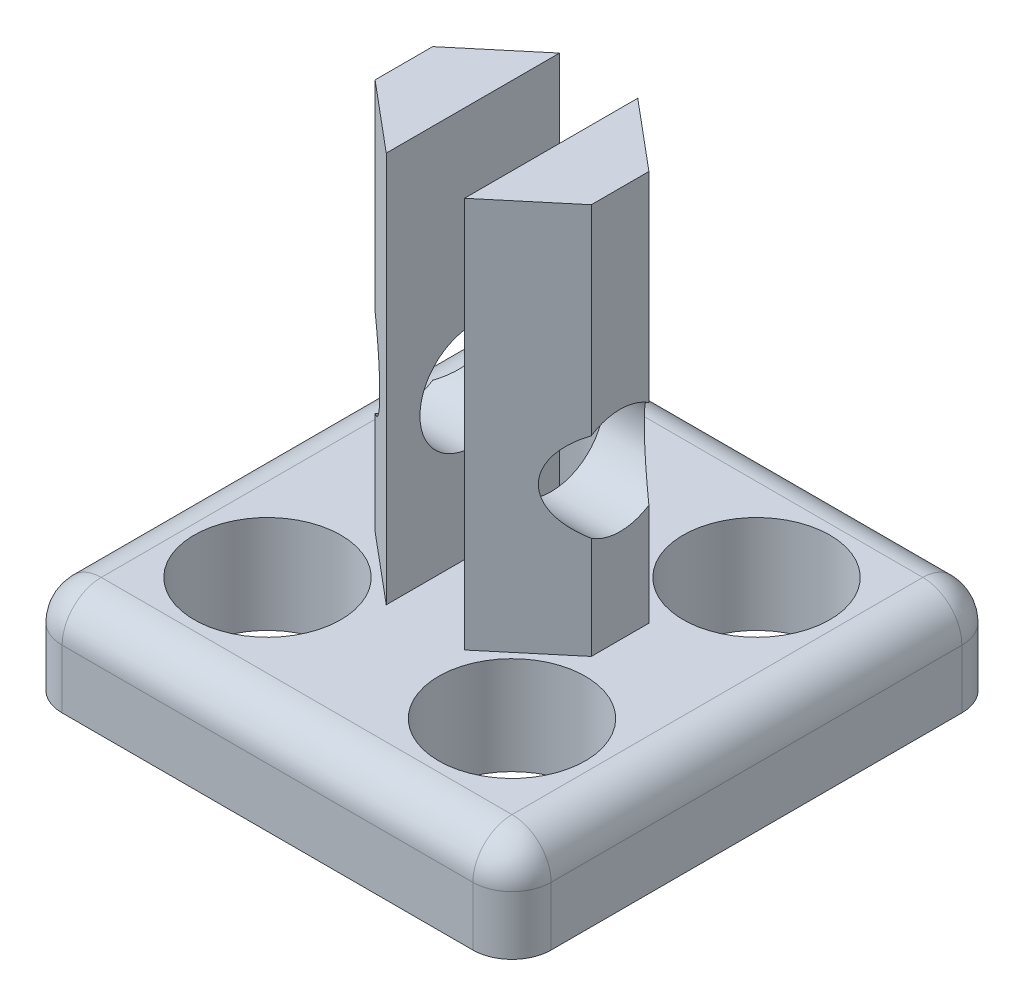
ISO-10303-21;
HEADER;
FILE_DESCRIPTION(('STEP AP214'),'2;1');
FILE_NAME('part.step','',(''),(''),'','','');
FILE_SCHEMA(('AUTOMOTIVE_DESIGN { 1 0 10303 214 1 1 1 1 }'));
ENDSEC;
DATA;
#1=APPLICATION_CONTEXT('core data for automotive mechanical design processes');
#2=APPLICATION_PROTOCOL_DEFINITION('international standard','automotive_design',2000,#1);
#3=PRODUCT_CONTEXT('',#1,'mechanical');
#4=PRODUCT('Part','Part','',(#3));
#5=PRODUCT_RELATED_PRODUCT_CATEGORY('part','',(#4));
#6=PRODUCT_DEFINITION_FORMATION('','',#4);
#7=PRODUCT_DEFINITION_CONTEXT('part definition',#1,'design');
#8=PRODUCT_DEFINITION('design','',#6,#7);
#9=PRODUCT_DEFINITION_SHAPE('','',#8);
#10=(LENGTH_UNIT() NAMED_UNIT(*) SI_UNIT(.MILLI.,.METRE.));
#11=(NAMED_UNIT(*) PLANE_ANGLE_UNIT() SI_UNIT($,.RADIAN.));
#12=(NAMED_UNIT(*) SI_UNIT($,.STERADIAN.) SOLID_ANGLE_UNIT());
#13=UNCERTAINTY_MEASURE_WITH_UNIT(LENGTH_MEASURE(1.E-05),#10,'distance_accuracy_value','');
#14=(GEOMETRIC_REPRESENTATION_CONTEXT(3) GLOBAL_UNCERTAINTY_ASSIGNED_CONTEXT((#13)) GLOBAL_UNIT_ASSIGNED_CONTEXT((#10,
#11,#12)) REPRESENTATION_CONTEXT('',''));
#15=CARTESIAN_POINT('',(0.,0.,0.));
#16=DIRECTION('',(0.,0.,1.));
#17=DIRECTION('',(1.,0.,0.));
#18=AXIS2_PLACEMENT_3D('',#15,#16,#17);
#19=CARTESIAN_POINT('',(-2.80786493422615,12.7,0.));
#20=DIRECTION('',(1.,0.,0.));
#21=DIRECTION('',(0.,0.,-1.));
#22=AXIS2_PLACEMENT_3D('',#19,#20,#21);
#23=PLANE('',#22);
#24=DIRECTION('',(0.,-1.,0.));
#25=VECTOR('',#24,1.);
#26=CARTESIAN_POINT('',(-2.80786493422615,12.7,-0.747994784831007));
#27=LINE('',#26,#25);
#28=CARTESIAN_POINT('',(-2.80786493422615,12.7,-0.747994784831007));
#29=VERTEX_POINT('',#28);
#30=CARTESIAN_POINT('',(-2.80786493422615,7.50374555334598,-0.747994784831007));
#31=VERTEX_POINT('',#30);
#32=EDGE_CURVE('E280',#29,#31,#27,.T.);
#33=ORIENTED_EDGE('',*,*,#32,.T.);
#34=CARTESIAN_POINT('',(-2.80786493422615,6.35,0.));
#35=DIRECTION('',(1.,0.,0.));
#36=DIRECTION('',(0.,0.,-1.));
#37=AXIS2_PLACEMENT_3D('',#34,#35,#36);
#38=CIRCLE('',#37,1.375);
#39=CARTESIAN_POINT('',(-2.80786493422615,7.50374555334598,0.747994784831009));
#40=VERTEX_POINT('',#39);
#41=EDGE_CURVE('E455',#31,#40,#38,.T.);
#42=ORIENTED_EDGE('',*,*,#41,.T.);
#43=DIRECTION('',(0.,-1.,0.));
#44=VECTOR('',#43,1.);
#45=CARTESIAN_POINT('',(-2.80786493422615,12.7,0.747994784831009));
#46=LINE('',#45,#44);
#47=CARTESIAN_POINT('',(-2.80786493422615,12.7,0.747994784831009));
#48=VERTEX_POINT('',#47);
#49=EDGE_CURVE('E275',#48,#40,#46,.T.);
#50=ORIENTED_EDGE('',*,*,#49,.F.);
#51=DIRECTION('',(0.,0.,1.));
#52=VECTOR('',#51,1.);
#53=CARTESIAN_POINT('',(-2.80786493422615,12.7,0.));
#54=LINE('',#53,#52);
#55=EDGE_CURVE('E243',#29,#48,#54,.T.);
#56=ORIENTED_EDGE('',*,*,#55,.F.);
#57=EDGE_LOOP('',(#33,#42,#50,#56));
#58=FACE_BOUND('',#57,.T.);
#59=ADVANCED_FACE('F46',(#58),#23,.F.);
#60=CARTESIAN_POINT('',(2.80786493422615,12.7,0.));
#61=DIRECTION('',(-1.,0.,0.));
#62=DIRECTION('',(0.,0.,1.));
#63=AXIS2_PLACEMENT_3D('',#60,#61,#62);
#64=PLANE('',#63);
#65=DIRECTION('',(0.,-1.,0.));
#66=VECTOR('',#65,1.);
#67=CARTESIAN_POINT('',(2.80786493422615,12.7,0.747994784831009));
#68=LINE('',#67,#66);
#69=CARTESIAN_POINT('',(2.80786493422615,12.7,0.747994784831009));
#70=VERTEX_POINT('',#69);
#71=CARTESIAN_POINT('',(2.80786493422615,7.50374555334598,0.747994784831009));
#72=VERTEX_POINT('',#71);
#73=EDGE_CURVE('E215',#70,#72,#68,.T.);
#74=ORIENTED_EDGE('',*,*,#73,.T.);
#75=CARTESIAN_POINT('',(2.80786493422615,6.35,0.));
#76=DIRECTION('',(1.,0.,0.));
#77=DIRECTION('',(0.,0.,-1.));
#78=AXIS2_PLACEMENT_3D('',#75,#76,#77);
#79=CIRCLE('',#78,1.375);
#80=CARTESIAN_POINT('',(2.80786493422615,7.50374555334598,-0.747994784831007));
#81=VERTEX_POINT('',#80);
#82=EDGE_CURVE('E197',#81,#72,#79,.T.);
#83=ORIENTED_EDGE('',*,*,#82,.F.);
#84=DIRECTION('',(0.,-1.,0.));
#85=VECTOR('',#84,1.);
#86=CARTESIAN_POINT('',(2.80786493422615,12.7,-0.747994784831007));
#87=LINE('',#86,#85);
#88=CARTESIAN_POINT('',(2.80786493422615,12.7,-0.747994784831007));
#89=VERTEX_POINT('',#88);
#90=EDGE_CURVE('E213',#89,#81,#87,.T.);
#91=ORIENTED_EDGE('',*,*,#90,.F.);
#92=DIRECTION('',(0.,0.,-1.));
#93=VECTOR('',#92,1.);
#94=CARTESIAN_POINT('',(2.80786493422615,12.7,0.));
#95=LINE('',#94,#93);
#96=EDGE_CURVE('E469',#70,#89,#95,.T.);
#97=ORIENTED_EDGE('',*,*,#96,.F.);
#98=EDGE_LOOP('',(#74,#83,#91,#97));
#99=FACE_BOUND('',#98,.T.);
#100=ADVANCED_FACE('F211',(#99),#64,.F.);
#101=CARTESIAN_POINT('',(0.,2.54,0.));
#102=DIRECTION('',(0.,-1.,0.));
#103=DIRECTION('',(0.,0.,-1.));
#104=AXIS2_PLACEMENT_3D('',#101,#102,#103);
#105=PLANE('',#104);
#106=DIRECTION('',(0.,0.,-1.));
#107=VECTOR('',#106,1.);
#108=CARTESIAN_POINT('',(5.334,2.54,0.));
#109=LINE('',#108,#107);
#110=CARTESIAN_POINT('',(5.334,2.54,5.334));
#111=VERTEX_POINT('',#110);
#112=CARTESIAN_POINT('',(5.334,2.54,-5.334));
#113=VERTEX_POINT('',#112);
#114=EDGE_CURVE('E363',#111,#113,#109,.T.);
#115=ORIENTED_EDGE('',*,*,#114,.T.);
#116=DIRECTION('',(-1.,0.,0.));
#117=VECTOR('',#116,1.);
#118=CARTESIAN_POINT('',(0.,2.54,-5.334));
#119=LINE('',#118,#117);
#120=CARTESIAN_POINT('',(-5.334,2.54,-5.334));
#121=VERTEX_POINT('',#120);
#122=EDGE_CURVE('E369',#113,#121,#119,.T.);
#123=ORIENTED_EDGE('',*,*,#122,.T.);
#124=DIRECTION('',(0.,0.,1.));
#125=VECTOR('',#124,1.);
#126=CARTESIAN_POINT('',(-5.334,2.54,0.));
#127=LINE('',#126,#125);
#128=CARTESIAN_POINT('',(-5.334,2.54,5.334));
#129=VERTEX_POINT('',#128);
#130=EDGE_CURVE('E366',#121,#129,#127,.T.);
#131=ORIENTED_EDGE('',*,*,#130,.T.);
#132=DIRECTION('',(1.,0.,0.));
#133=VECTOR('',#132,1.);
#134=CARTESIAN_POINT('',(0.,2.54,5.334));
#135=LINE('',#134,#133);
#136=EDGE_CURVE('E360',#129,#111,#135,.T.);
#137=ORIENTED_EDGE('',*,*,#136,.T.);
#138=EDGE_LOOP('',(#115,#123,#131,#137));
#139=FACE_BOUND('',#138,.T.);
#140=DIRECTION('',(-0.766420748473941,0.,0.642338879648932));
#141=VECTOR('',#140,1.);
#142=CARTESIAN_POINT('',(1.52676214007822,2.54,1.821689795237));
#143=LINE('',#142,#141);
#144=CARTESIAN_POINT('',(2.80786493422615,2.54,0.747994784831009));
#145=VERTEX_POINT('',#144);
#146=CARTESIAN_POINT('',(1.016,2.54,2.24976064467342));
#147=VERTEX_POINT('',#146);
#148=EDGE_CURVE('E476',#145,#147,#143,.T.);
#149=ORIENTED_EDGE('',*,*,#148,.T.);
#150=DIRECTION('',(0.,0.,-1.));
#151=VECTOR('',#150,1.);
#152=CARTESIAN_POINT('',(1.016,2.54,0.));
#153=LINE('',#152,#151);
#154=CARTESIAN_POINT('',(1.016,2.54,-2.24976064467342));
#155=VERTEX_POINT('',#154);
#156=EDGE_CURVE('E459',#147,#155,#153,.T.);
#157=ORIENTED_EDGE('',*,*,#156,.T.);
#158=DIRECTION('',(-0.766420748473941,0.,-0.642338879648931));
#159=VECTOR('',#158,1.);
#160=CARTESIAN_POINT('',(1.52676214007822,2.54,-1.821689795237));
#161=LINE('',#160,#159);
#162=CARTESIAN_POINT('',(2.80786493422615,2.54,-0.747994784831007));
#163=VERTEX_POINT('',#162);
#164=EDGE_CURVE('E465',#163,#155,#161,.T.);
#165=ORIENTED_EDGE('',*,*,#164,.F.);
#166=DIRECTION('',(0.,0.,-1.));
#167=VECTOR('',#166,1.);
#168=CARTESIAN_POINT('',(2.80786493422615,2.54,0.));
#169=LINE('',#168,#167);
#170=EDGE_CURVE('E479',#145,#163,#169,.T.);
#171=ORIENTED_EDGE('',*,*,#170,.F.);
#172=EDGE_LOOP('',(#149,#157,#165,#171));
#173=FACE_BOUND('',#172,.T.);
#174=DIRECTION('',(0.,0.,1.));
#175=VECTOR('',#174,1.);
#176=CARTESIAN_POINT('',(-2.80786493422615,2.54,0.));
#177=LINE('',#176,#175);
#178=CARTESIAN_POINT('',(-2.80786493422615,2.54,-0.747994784831007));
#179=VERTEX_POINT('',#178);
#180=CARTESIAN_POINT('',(-2.80786493422615,2.54,0.747994784831008));
#181=VERTEX_POINT('',#180);
#182=EDGE_CURVE('E256',#179,#181,#177,.T.);
#183=ORIENTED_EDGE('',*,*,#182,.F.);
#184=DIRECTION('',(0.766420748473941,0.,-0.642338879648931));
#185=VECTOR('',#184,1.);
#186=CARTESIAN_POINT('',(-1.52676214007822,2.54,-1.821689795237));
#187=LINE('',#186,#185);
#188=CARTESIAN_POINT('',(-1.016,2.54,-2.24976064467342));
#189=VERTEX_POINT('',#188);
#190=EDGE_CURVE('E238',#179,#189,#187,.T.);
#191=ORIENTED_EDGE('',*,*,#190,.T.);
#192=DIRECTION('',(0.,0.,-1.));
#193=VECTOR('',#192,1.);
#194=CARTESIAN_POINT('',(-1.016,2.54,0.));
#195=LINE('',#194,#193);
#196=CARTESIAN_POINT('',(-1.016,2.54,2.24976064467342));
#197=VERTEX_POINT('',#196);
#198=EDGE_CURVE('E244',#197,#189,#195,.T.);
#199=ORIENTED_EDGE('',*,*,#198,.F.);
#200=DIRECTION('',(0.766420748473941,0.,0.642338879648932));
#201=VECTOR('',#200,1.);
#202=CARTESIAN_POINT('',(-1.52676214007822,2.54,1.821689795237));
#203=LINE('',#202,#201);
#204=EDGE_CURVE('E260',#181,#197,#203,.T.);
#205=ORIENTED_EDGE('',*,*,#204,.F.);
#206=EDGE_LOOP('',(#183,#191,#199,#205));
#207=FACE_BOUND('',#206,.T.);
#208=CARTESIAN_POINT('',(-3.175,2.54,-3.175));
#209=DIRECTION('',(0.,1.,0.));
#210=DIRECTION('',(0.,0.,1.));
#211=AXIS2_PLACEMENT_3D('',#208,#209,#210);
#212=CIRCLE('',#211,1.905);
#213=CARTESIAN_POINT('',(-3.175,2.54,-1.27));
#214=VERTEX_POINT('',#213);
#215=EDGE_CURVE('E309',#214,#214,#212,.T.);
#216=ORIENTED_EDGE('',*,*,#215,.F.);
#217=EDGE_LOOP('',(#216));
#218=FACE_BOUND('',#217,.T.);
#219=CARTESIAN_POINT('',(3.175,2.54,-3.175));
#220=DIRECTION('',(0.,1.,0.));
#221=DIRECTION('',(0.,0.,-1.));
#222=AXIS2_PLACEMENT_3D('',#219,#220,#221);
#223=CIRCLE('',#222,1.905);
#224=CARTESIAN_POINT('',(3.175,2.54,-5.08));
#225=VERTEX_POINT('',#224);
#226=EDGE_CURVE('E301',#225,#225,#223,.T.);
#227=ORIENTED_EDGE('',*,*,#226,.F.);
#228=EDGE_LOOP('',(#227));
#229=FACE_BOUND('',#228,.T.);
#230=CARTESIAN_POINT('',(3.175,2.54,3.175));
#231=DIRECTION('',(0.,1.,0.));
#232=DIRECTION('',(0.,0.,1.));
#233=AXIS2_PLACEMENT_3D('',#230,#231,#232);
#234=CIRCLE('',#233,1.905);
#235=CARTESIAN_POINT('',(3.175,2.54,5.08));
#236=VERTEX_POINT('',#235);
#237=EDGE_CURVE('E293',#236,#236,#234,.T.);
#238=ORIENTED_EDGE('',*,*,#237,.F.);
#239=EDGE_LOOP('',(#238));
#240=FACE_BOUND('',#239,.T.);
#241=CARTESIAN_POINT('',(-3.175,2.54,3.175));
#242=DIRECTION('',(0.,1.,0.));
#243=DIRECTION('',(0.,0.,-1.));
#244=AXIS2_PLACEMENT_3D('',#241,#242,#243);
#245=CIRCLE('',#244,1.905);
#246=CARTESIAN_POINT('',(-3.175,2.54,1.27));
#247=VERTEX_POINT('',#246);
#248=EDGE_CURVE('E285',#247,#247,#245,.T.);
#249=ORIENTED_EDGE('',*,*,#248,.F.);
#250=EDGE_LOOP('',(#249));
#251=FACE_BOUND('',#250,.T.);
#252=ADVANCED_FACE('F488',(#139,#173,#207,#218,#229,#240,#251),#105,.F.);
#253=CARTESIAN_POINT('',(0.,0.,0.));
#254=DIRECTION('',(0.,-1.,0.));
#255=DIRECTION('',(0.,0.,-1.));
#256=AXIS2_PLACEMENT_3D('',#253,#254,#255);
#257=PLANE('',#256);
#258=CARTESIAN_POINT('',(3.175,0.,3.175));
#259=DIRECTION('',(0.,1.,0.));
#260=DIRECTION('',(0.,0.,1.));
#261=AXIS2_PLACEMENT_3D('',#258,#259,#260);
#262=CIRCLE('',#261,1.905);
#263=CARTESIAN_POINT('',(3.175,0.,5.08));
#264=VERTEX_POINT('',#263);
#265=EDGE_CURVE('E289',#264,#264,#262,.T.);
#266=ORIENTED_EDGE('',*,*,#265,.T.);
#267=EDGE_LOOP('',(#266));
#268=FACE_BOUND('',#267,.T.);
#269=CARTESIAN_POINT('',(-3.175,0.,-3.175));
#270=DIRECTION('',(0.,1.,0.));
#271=DIRECTION('',(0.,0.,1.));
#272=AXIS2_PLACEMENT_3D('',#269,#270,#271);
#273=CIRCLE('',#272,1.905);
#274=CARTESIAN_POINT('',(-3.175,0.,-1.27));
#275=VERTEX_POINT('',#274);
#276=EDGE_CURVE('E305',#275,#275,#273,.T.);
#277=ORIENTED_EDGE('',*,*,#276,.T.);
#278=EDGE_LOOP('',(#277));
#279=FACE_BOUND('',#278,.T.);
#280=DIRECTION('',(-1.,0.,0.));
#281=VECTOR('',#280,1.);
#282=CARTESIAN_POINT('',(-6.35,0.,-6.35));
#283=LINE('',#282,#281);
#284=CARTESIAN_POINT('',(5.334,0.,-6.35));
#285=VERTEX_POINT('',#284);
#286=CARTESIAN_POINT('',(-5.334,0.,-6.35));
#287=VERTEX_POINT('',#286);
#288=EDGE_CURVE('E320',#285,#287,#283,.T.);
#289=ORIENTED_EDGE('',*,*,#288,.F.);
#290=CARTESIAN_POINT('',(5.334,0.,-5.334));
#291=DIRECTION('',(0.,-1.,0.));
#292=DIRECTION('',(0.,0.,-1.));
#293=AXIS2_PLACEMENT_3D('',#290,#291,#292);
#294=CIRCLE('',#293,1.016);
#295=CARTESIAN_POINT('',(6.35,0.,-5.334));
#296=VERTEX_POINT('',#295);
#297=EDGE_CURVE('E348',#285,#296,#294,.T.);
#298=ORIENTED_EDGE('',*,*,#297,.T.);
#299=DIRECTION('',(0.,0.,-1.));
#300=VECTOR('',#299,1.);
#301=CARTESIAN_POINT('',(6.35,0.,6.35));
#302=LINE('',#301,#300);
#303=CARTESIAN_POINT('',(6.35,0.,5.334));
#304=VERTEX_POINT('',#303);
#305=EDGE_CURVE('E313',#304,#296,#302,.T.);
#306=ORIENTED_EDGE('',*,*,#305,.F.);
#307=CARTESIAN_POINT('',(5.334,0.,5.334));
#308=DIRECTION('',(0.,-1.,0.));
#309=DIRECTION('',(0.,0.,-1.));
#310=AXIS2_PLACEMENT_3D('',#307,#308,#309);
#311=CIRCLE('',#310,1.016);
#312=CARTESIAN_POINT('',(5.334,0.,6.35));
#313=VERTEX_POINT('',#312);
#314=EDGE_CURVE('E339',#304,#313,#311,.T.);
#315=ORIENTED_EDGE('',*,*,#314,.T.);
#316=DIRECTION('',(1.,0.,0.));
#317=VECTOR('',#316,1.);
#318=CARTESIAN_POINT('',(-6.35,0.,6.35));
#319=LINE('',#318,#317);
#320=CARTESIAN_POINT('',(-5.334,0.,6.35));
#321=VERTEX_POINT('',#320);
#322=EDGE_CURVE('E206',#321,#313,#319,.T.);
#323=ORIENTED_EDGE('',*,*,#322,.F.);
#324=CARTESIAN_POINT('',(-5.334,0.,5.334));
#325=DIRECTION('',(0.,-1.,0.));
#326=DIRECTION('',(0.,0.,-1.));
#327=AXIS2_PLACEMENT_3D('',#324,#325,#326);
#328=CIRCLE('',#327,1.016);
#329=CARTESIAN_POINT('',(-6.35,0.,5.334));
#330=VERTEX_POINT('',#329);
#331=EDGE_CURVE('E342',#321,#330,#328,.T.);
#332=ORIENTED_EDGE('',*,*,#331,.T.);
#333=DIRECTION('',(0.,0.,1.));
#334=VECTOR('',#333,1.);
#335=CARTESIAN_POINT('',(-6.35,0.,6.35));
#336=LINE('',#335,#334);
#337=CARTESIAN_POINT('',(-6.35,0.,-5.334));
#338=VERTEX_POINT('',#337);
#339=EDGE_CURVE('E324',#338,#330,#336,.T.);
#340=ORIENTED_EDGE('',*,*,#339,.F.);
#341=CARTESIAN_POINT('',(-5.334,0.,-5.334));
#342=DIRECTION('',(0.,-1.,0.));
#343=DIRECTION('',(0.,0.,-1.));
#344=AXIS2_PLACEMENT_3D('',#341,#342,#343);
#345=CIRCLE('',#344,1.016);
#346=EDGE_CURVE('E345',#338,#287,#345,.T.);
#347=ORIENTED_EDGE('',*,*,#346,.T.);
#348=EDGE_LOOP('',(#289,#298,#306,#315,#323,#332,#340,#347));
#349=FACE_BOUND('',#348,.T.);
#350=CARTESIAN_POINT('',(3.175,0.,-3.175));
#351=DIRECTION('',(0.,1.,0.));
#352=DIRECTION('',(0.,0.,-1.));
#353=AXIS2_PLACEMENT_3D('',#350,#351,#352);
#354=CIRCLE('',#353,1.905);
#355=CARTESIAN_POINT('',(3.175,0.,-5.08));
#356=VERTEX_POINT('',#355);
#357=EDGE_CURVE('E297',#356,#356,#354,.T.);
#358=ORIENTED_EDGE('',*,*,#357,.T.);
#359=EDGE_LOOP('',(#358));
#360=FACE_BOUND('',#359,.T.);
#361=CARTESIAN_POINT('',(-3.175,0.,3.175));
#362=DIRECTION('',(0.,1.,0.));
#363=DIRECTION('',(0.,0.,-1.));
#364=AXIS2_PLACEMENT_3D('',#361,#362,#363);
#365=CIRCLE('',#364,1.905);
#366=CARTESIAN_POINT('',(-3.175,0.,1.27));
#367=VERTEX_POINT('',#366);
#368=EDGE_CURVE('E284',#367,#367,#365,.T.);
#369=ORIENTED_EDGE('',*,*,#368,.T.);
#370=EDGE_LOOP('',(#369));
#371=FACE_BOUND('',#370,.T.);
#372=ADVANCED_FACE('F610',(#268,#279,#349,#360,#371),#257,.T.);
#373=CARTESIAN_POINT('',(6.35,2.54,6.35));
#374=DIRECTION('',(-1.,0.,0.));
#375=DIRECTION('',(0.,0.,1.));
#376=AXIS2_PLACEMENT_3D('',#373,#374,#375);
#377=PLANE('',#376);
#378=ORIENTED_EDGE('',*,*,#305,.T.);
#379=DIRECTION('',(0.,-1.,0.));
#380=VECTOR('',#379,1.);
#381=CARTESIAN_POINT('',(6.35,2.54,-5.334));
#382=LINE('',#381,#380);
#383=CARTESIAN_POINT('',(6.35,1.524,-5.334));
#384=VERTEX_POINT('',#383);
#385=EDGE_CURVE('E357',#296,#384,#382,.F.);
#386=ORIENTED_EDGE('',*,*,#385,.T.);
#387=DIRECTION('',(0.,0.,-1.));
#388=VECTOR('',#387,1.);
#389=CARTESIAN_POINT('',(6.35,1.524,6.35));
#390=LINE('',#389,#388);
#391=CARTESIAN_POINT('',(6.35,1.524,5.334));
#392=VERTEX_POINT('',#391);
#393=EDGE_CURVE('E351',#384,#392,#390,.F.);
#394=ORIENTED_EDGE('',*,*,#393,.T.);
#395=DIRECTION('',(0.,-1.,0.));
#396=VECTOR('',#395,1.);
#397=CARTESIAN_POINT('',(6.35,2.54,5.334));
#398=LINE('',#397,#396);
#399=EDGE_CURVE('E354',#392,#304,#398,.T.);
#400=ORIENTED_EDGE('',*,*,#399,.T.);
#401=EDGE_LOOP('',(#378,#386,#394,#400));
#402=FACE_BOUND('',#401,.T.);
#403=ADVANCED_FACE('F621',(#402),#377,.F.);
#404=CARTESIAN_POINT('',(-6.35,2.54,-6.35));
#405=DIRECTION('',(0.,0.,1.));
#406=DIRECTION('',(1.,0.,0.));
#407=AXIS2_PLACEMENT_3D('',#404,#405,#406);
#408=PLANE('',#407);
#409=DIRECTION('',(-1.,0.,0.));
#410=VECTOR('',#409,1.);
#411=CARTESIAN_POINT('',(-6.35,1.524,-6.35));
#412=LINE('',#411,#410);
#413=CARTESIAN_POINT('',(-5.334,1.524,-6.35));
#414=VERTEX_POINT('',#413);
#415=CARTESIAN_POINT('',(5.334,1.524,-6.35));
#416=VERTEX_POINT('',#415);
#417=EDGE_CURVE('E332',#414,#416,#412,.F.);
#418=ORIENTED_EDGE('',*,*,#417,.T.);
#419=DIRECTION('',(0.,-1.,0.));
#420=VECTOR('',#419,1.);
#421=CARTESIAN_POINT('',(5.334,2.54,-6.35));
#422=LINE('',#421,#420);
#423=EDGE_CURVE('E335',#416,#285,#422,.T.);
#424=ORIENTED_EDGE('',*,*,#423,.T.);
#425=ORIENTED_EDGE('',*,*,#288,.T.);
#426=DIRECTION('',(0.,-1.,0.));
#427=VECTOR('',#426,1.);
#428=CARTESIAN_POINT('',(-5.334,2.54,-6.35));
#429=LINE('',#428,#427);
#430=EDGE_CURVE('E205',#287,#414,#429,.F.);
#431=ORIENTED_EDGE('',*,*,#430,.T.);
#432=EDGE_LOOP('',(#418,#424,#425,#431));
#433=FACE_BOUND('',#432,.T.);
#434=ADVANCED_FACE('F632',(#433),#408,.F.);
#435=CARTESIAN_POINT('',(-6.35,2.54,6.35));
#436=DIRECTION('',(1.,0.,0.));
#437=DIRECTION('',(0.,0.,-1.));
#438=AXIS2_PLACEMENT_3D('',#435,#436,#437);
#439=PLANE('',#438);
#440=DIRECTION('',(0.,0.,1.));
#441=VECTOR('',#440,1.);
#442=CARTESIAN_POINT('',(-6.35,1.524,6.35));
#443=LINE('',#442,#441);
#444=CARTESIAN_POINT('',(-6.35,1.524,5.334));
#445=VERTEX_POINT('',#444);
#446=CARTESIAN_POINT('',(-6.35,1.524,-5.334));
#447=VERTEX_POINT('',#446);
#448=EDGE_CURVE('E373',#445,#447,#443,.F.);
#449=ORIENTED_EDGE('',*,*,#448,.T.);
#450=DIRECTION('',(0.,-1.,0.));
#451=VECTOR('',#450,1.);
#452=CARTESIAN_POINT('',(-6.35,2.54,-5.334));
#453=LINE('',#452,#451);
#454=EDGE_CURVE('E379',#447,#338,#453,.T.);
#455=ORIENTED_EDGE('',*,*,#454,.T.);
#456=ORIENTED_EDGE('',*,*,#339,.T.);
#457=DIRECTION('',(0.,-1.,0.));
#458=VECTOR('',#457,1.);
#459=CARTESIAN_POINT('',(-6.35,2.54,5.334));
#460=LINE('',#459,#458);
#461=EDGE_CURVE('E376',#330,#445,#460,.F.);
#462=ORIENTED_EDGE('',*,*,#461,.T.);
#463=EDGE_LOOP('',(#449,#455,#456,#462));
#464=FACE_BOUND('',#463,.T.);
#465=ADVANCED_FACE('F643',(#464),#439,.F.);
#466=CARTESIAN_POINT('',(-6.35,2.54,6.35));
#467=DIRECTION('',(0.,0.,-1.));
#468=DIRECTION('',(-1.,0.,0.));
#469=AXIS2_PLACEMENT_3D('',#466,#467,#468);
#470=PLANE('',#469);
#471=DIRECTION('',(1.,0.,0.));
#472=VECTOR('',#471,1.);
#473=CARTESIAN_POINT('',(-6.35,1.524,6.35));
#474=LINE('',#473,#472);
#475=CARTESIAN_POINT('',(5.334,1.524,6.35));
#476=VERTEX_POINT('',#475);
#477=CARTESIAN_POINT('',(-5.334,1.524,6.35));
#478=VERTEX_POINT('',#477);
#479=EDGE_CURVE('E63',#476,#478,#474,.F.);
#480=ORIENTED_EDGE('',*,*,#479,.T.);
#481=DIRECTION('',(0.,-1.,0.));
#482=VECTOR('',#481,1.);
#483=CARTESIAN_POINT('',(-5.334,2.54,6.35));
#484=LINE('',#483,#482);
#485=EDGE_CURVE('E11',#478,#321,#484,.T.);
#486=ORIENTED_EDGE('',*,*,#485,.T.);
#487=ORIENTED_EDGE('',*,*,#322,.T.);
#488=DIRECTION('',(0.,-1.,0.));
#489=VECTOR('',#488,1.);
#490=CARTESIAN_POINT('',(5.334,2.54,6.35));
#491=LINE('',#490,#489);
#492=EDGE_CURVE('E56',#313,#476,#491,.F.);
#493=ORIENTED_EDGE('',*,*,#492,.T.);
#494=EDGE_LOOP('',(#480,#486,#487,#493));
#495=FACE_BOUND('',#494,.T.);
#496=ADVANCED_FACE('F654',(#495),#470,.F.);
#497=CARTESIAN_POINT('',(-3.175,2.54,-3.175));
#498=DIRECTION('',(0.,-1.,0.));
#499=DIRECTION('',(0.,0.,-1.));
#500=AXIS2_PLACEMENT_3D('',#497,#498,#499);
#501=CYLINDRICAL_SURFACE('',#500,1.905);
#502=ORIENTED_EDGE('',*,*,#215,.T.);
#503=EDGE_LOOP('',(#502));
#504=FACE_BOUND('',#503,.T.);
#505=ORIENTED_EDGE('',*,*,#276,.F.);
#506=EDGE_LOOP('',(#505));
#507=FACE_BOUND('',#506,.T.);
#508=ADVANCED_FACE('F665',(#504,#507),#501,.F.);
#509=CARTESIAN_POINT('',(3.175,2.54,-3.175));
#510=DIRECTION('',(0.,-1.,0.));
#511=DIRECTION('',(0.,0.,-1.));
#512=AXIS2_PLACEMENT_3D('',#509,#510,#511);
#513=CYLINDRICAL_SURFACE('',#512,1.905);
#514=ORIENTED_EDGE('',*,*,#226,.T.);
#515=EDGE_LOOP('',(#514));
#516=FACE_BOUND('',#515,.T.);
#517=ORIENTED_EDGE('',*,*,#357,.F.);
#518=EDGE_LOOP('',(#517));
#519=FACE_BOUND('',#518,.T.);
#520=ADVANCED_FACE('F889',(#516,#519),#513,.F.);
#521=CARTESIAN_POINT('',(3.175,2.54,3.175));
#522=DIRECTION('',(0.,-1.,0.));
#523=DIRECTION('',(0.,0.,-1.));
#524=AXIS2_PLACEMENT_3D('',#521,#522,#523);
#525=CYLINDRICAL_SURFACE('',#524,1.905);
#526=ORIENTED_EDGE('',*,*,#237,.T.);
#527=EDGE_LOOP('',(#526));
#528=FACE_BOUND('',#527,.T.);
#529=ORIENTED_EDGE('',*,*,#265,.F.);
#530=EDGE_LOOP('',(#529));
#531=FACE_BOUND('',#530,.T.);
#532=ADVANCED_FACE('F879',(#528,#531),#525,.F.);
#533=CARTESIAN_POINT('',(-3.175,2.54,3.175));
#534=DIRECTION('',(0.,-1.,0.));
#535=DIRECTION('',(0.,0.,-1.));
#536=AXIS2_PLACEMENT_3D('',#533,#534,#535);
#537=CYLINDRICAL_SURFACE('',#536,1.905);
#538=ORIENTED_EDGE('',*,*,#248,.T.);
#539=EDGE_LOOP('',(#538));
#540=FACE_BOUND('',#539,.T.);
#541=ORIENTED_EDGE('',*,*,#368,.F.);
#542=EDGE_LOOP('',(#541));
#543=FACE_BOUND('',#542,.T.);
#544=ADVANCED_FACE('F534',(#540,#543),#537,.F.);
#545=CARTESIAN_POINT('',(-1.52676214007822,12.7,-1.821689795237));
#546=DIRECTION('',(-0.642338879648931,0.,-0.766420748473941));
#547=DIRECTION('',(-0.766420748473941,0.,0.642338879648931));
#548=AXIS2_PLACEMENT_3D('',#545,#546,#547);
#549=PLANE('',#548);
#550=CARTESIAN_POINT('',(-3.70035134756315,6.35,0.));
#551=DIRECTION('',(-0.642338879648931,0.,-0.766420748473941));
#552=DIRECTION('',(0.766420748473941,0.,-0.642338879648931));
#553=AXIS2_PLACEMENT_3D('',#550,#551,#552);
#554=ELLIPSE('',#553,2.14061462502706,1.375);
#555=CARTESIAN_POINT('',(-2.80786493422615,5.19625444665402,-0.747994784831007));
#556=VERTEX_POINT('',#555);
#557=EDGE_CURVE('E456',#31,#556,#554,.T.);
#558=ORIENTED_EDGE('',*,*,#557,.F.);
#559=ORIENTED_EDGE('',*,*,#32,.F.);
#560=DIRECTION('',(0.766420748473941,0.,-0.642338879648931));
#561=VECTOR('',#560,1.);
#562=CARTESIAN_POINT('',(-1.52676214007822,12.7,-1.821689795237));
#563=LINE('',#562,#561);
#564=CARTESIAN_POINT('',(-1.016,12.7,-2.24976064467342));
#565=VERTEX_POINT('',#564);
#566=EDGE_CURVE('E239',#29,#565,#563,.T.);
#567=ORIENTED_EDGE('',*,*,#566,.T.);
#568=DIRECTION('',(0.,-1.,0.));
#569=VECTOR('',#568,1.);
#570=CARTESIAN_POINT('',(-1.016,12.7,-2.24976064467342));
#571=LINE('',#570,#569);
#572=EDGE_CURVE('E253',#565,#189,#571,.T.);
#573=ORIENTED_EDGE('',*,*,#572,.T.);
#574=ORIENTED_EDGE('',*,*,#190,.F.);
#575=EDGE_CURVE('E279',#556,#179,#27,.T.);
#576=ORIENTED_EDGE('',*,*,#575,.F.);
#577=EDGE_LOOP('',(#558,#559,#567,#573,#574,#576));
#578=FACE_BOUND('',#577,.T.);
#579=ADVANCED_FACE('F526',(#578),#549,.T.);
#580=CARTESIAN_POINT('',(-2.80786493422615,5.19625444665403,0.747994784831009));
#581=VERTEX_POINT('',#580);
#582=EDGE_CURVE('E274',#581,#181,#46,.T.);
#583=ORIENTED_EDGE('',*,*,#582,.F.);
#584=EDGE_CURVE('E451',#581,#556,#38,.T.);
#585=ORIENTED_EDGE('',*,*,#584,.T.);
#586=ORIENTED_EDGE('',*,*,#575,.T.);
#587=ORIENTED_EDGE('',*,*,#182,.T.);
#588=EDGE_LOOP('',(#583,#585,#586,#587));
#589=FACE_BOUND('',#588,.T.);
#590=ADVANCED_FACE('F517',(#589),#23,.F.);
#591=CARTESIAN_POINT('',(-1.52676214007822,12.7,1.821689795237));
#592=DIRECTION('',(0.642338879648932,0.,-0.766420748473941));
#593=DIRECTION('',(-0.766420748473941,0.,-0.642338879648932));
#594=AXIS2_PLACEMENT_3D('',#591,#592,#593);
#595=PLANE('',#594);
#596=ORIENTED_EDGE('',*,*,#49,.T.);
#597=CARTESIAN_POINT('',(-3.70035134756315,6.35,0.));
#598=DIRECTION('',(0.642338879648932,0.,-0.766420748473941));
#599=DIRECTION('',(0.766420748473941,0.,0.642338879648932));
#600=AXIS2_PLACEMENT_3D('',#597,#598,#599);
#601=ELLIPSE('',#600,2.14061462502706,1.375);
#602=EDGE_CURVE('E447',#40,#581,#601,.T.);
#603=ORIENTED_EDGE('',*,*,#602,.T.);
#604=ORIENTED_EDGE('',*,*,#582,.T.);
#605=ORIENTED_EDGE('',*,*,#204,.T.);
#606=DIRECTION('',(0.,-1.,0.));
#607=VECTOR('',#606,1.);
#608=CARTESIAN_POINT('',(-1.016,12.7,2.24976064467342));
#609=LINE('',#608,#607);
#610=CARTESIAN_POINT('',(-1.016,12.7,2.24976064467342));
#611=VERTEX_POINT('',#610);
#612=EDGE_CURVE('E270',#611,#197,#609,.T.);
#613=ORIENTED_EDGE('',*,*,#612,.F.);
#614=DIRECTION('',(0.766420748473941,0.,0.642338879648932));
#615=VECTOR('',#614,1.);
#616=CARTESIAN_POINT('',(-1.52676214007822,12.7,1.821689795237));
#617=LINE('',#616,#615);
#618=EDGE_CURVE('E247',#48,#611,#617,.T.);
#619=ORIENTED_EDGE('',*,*,#618,.F.);
#620=EDGE_LOOP('',(#596,#603,#604,#605,#613,#619));
#621=FACE_BOUND('',#620,.T.);
#622=ADVANCED_FACE('F525',(#621),#595,.F.);
#623=CARTESIAN_POINT('',(-1.016,12.7,0.));
#624=DIRECTION('',(-1.,0.,0.));
#625=DIRECTION('',(0.,0.,1.));
#626=AXIS2_PLACEMENT_3D('',#623,#624,#625);
#627=PLANE('',#626);
#628=CARTESIAN_POINT('',(-1.016,6.35,0.));
#629=DIRECTION('',(-1.,0.,0.));
#630=DIRECTION('',(0.,0.,1.));
#631=AXIS2_PLACEMENT_3D('',#628,#629,#630);
#632=CIRCLE('',#631,1.375);
#633=CARTESIAN_POINT('',(-1.016,6.35,1.375));
#634=VERTEX_POINT('',#633);
#635=EDGE_CURVE('E443',#634,#634,#632,.T.);
#636=ORIENTED_EDGE('',*,*,#635,.T.);
#637=EDGE_LOOP('',(#636));
#638=FACE_BOUND('',#637,.T.);
#639=ORIENTED_EDGE('',*,*,#198,.T.);
#640=ORIENTED_EDGE('',*,*,#572,.F.);
#641=DIRECTION('',(0.,0.,-1.));
#642=VECTOR('',#641,1.);
#643=CARTESIAN_POINT('',(-1.016,12.7,0.));
#644=LINE('',#643,#642);
#645=EDGE_CURVE('E250',#611,#565,#644,.T.);
#646=ORIENTED_EDGE('',*,*,#645,.F.);
#647=ORIENTED_EDGE('',*,*,#612,.T.);
#648=EDGE_LOOP('',(#639,#640,#646,#647));
#649=FACE_BOUND('',#648,.T.);
#650=ADVANCED_FACE('F532',(#638,#649),#627,.F.);
#651=CARTESIAN_POINT('',(0.,12.7,0.));
#652=DIRECTION('',(0.,1.,0.));
#653=DIRECTION('',(0.,0.,1.));
#654=AXIS2_PLACEMENT_3D('',#651,#652,#653);
#655=PLANE('',#654);
#656=ORIENTED_EDGE('',*,*,#566,.F.);
#657=ORIENTED_EDGE('',*,*,#55,.T.);
#658=ORIENTED_EDGE('',*,*,#618,.T.);
#659=ORIENTED_EDGE('',*,*,#645,.T.);
#660=EDGE_LOOP('',(#656,#657,#658,#659));
#661=FACE_BOUND('',#660,.T.);
#662=ADVANCED_FACE('F552',(#661),#655,.T.);
#663=CARTESIAN_POINT('',(1.016,12.7,0.));
#664=DIRECTION('',(-1.,0.,0.));
#665=DIRECTION('',(0.,0.,1.));
#666=AXIS2_PLACEMENT_3D('',#663,#664,#665);
#667=PLANE('',#666);
#668=CARTESIAN_POINT('',(1.016,6.35,0.));
#669=DIRECTION('',(-1.,0.,0.));
#670=DIRECTION('',(0.,0.,1.));
#671=AXIS2_PLACEMENT_3D('',#668,#669,#670);
#672=CIRCLE('',#671,1.375);
#673=CARTESIAN_POINT('',(1.016,6.35,1.375));
#674=VERTEX_POINT('',#673);
#675=EDGE_CURVE('E439',#674,#674,#672,.T.);
#676=ORIENTED_EDGE('',*,*,#675,.F.);
#677=EDGE_LOOP('',(#676));
#678=FACE_BOUND('',#677,.T.);
#679=ORIENTED_EDGE('',*,*,#156,.F.);
#680=DIRECTION('',(0.,-1.,0.));
#681=VECTOR('',#680,1.);
#682=CARTESIAN_POINT('',(1.016,12.7,2.24976064467342));
#683=LINE('',#682,#681);
#684=CARTESIAN_POINT('',(1.016,12.7,2.24976064467342));
#685=VERTEX_POINT('',#684);
#686=EDGE_CURVE('E234',#685,#147,#683,.T.);
#687=ORIENTED_EDGE('',*,*,#686,.F.);
#688=DIRECTION('',(0.,0.,-1.));
#689=VECTOR('',#688,1.);
#690=CARTESIAN_POINT('',(1.016,12.7,0.));
#691=LINE('',#690,#689);
#692=CARTESIAN_POINT('',(1.016,12.7,-2.24976064467342));
#693=VERTEX_POINT('',#692);
#694=EDGE_CURVE('E460',#685,#693,#691,.T.);
#695=ORIENTED_EDGE('',*,*,#694,.T.);
#696=DIRECTION('',(0.,-1.,0.));
#697=VECTOR('',#696,1.);
#698=CARTESIAN_POINT('',(1.016,12.7,-2.24976064467342));
#699=LINE('',#698,#697);
#700=EDGE_CURVE('E229',#693,#155,#699,.T.);
#701=ORIENTED_EDGE('',*,*,#700,.T.);
#702=EDGE_LOOP('',(#679,#687,#695,#701));
#703=FACE_BOUND('',#702,.T.);
#704=ADVANCED_FACE('F500',(#678,#703),#667,.T.);
#705=CARTESIAN_POINT('',(1.52676214007822,12.7,1.821689795237));
#706=DIRECTION('',(0.642338879648932,0.,0.766420748473941));
#707=DIRECTION('',(0.766420748473941,0.,-0.642338879648932));
#708=AXIS2_PLACEMENT_3D('',#705,#706,#707);
#709=PLANE('',#708);
#710=CARTESIAN_POINT('',(3.70035134756315,6.35,0.));
#711=DIRECTION('',(0.642338879648932,0.,0.766420748473941));
#712=DIRECTION('',(0.766420748473941,0.,-0.642338879648932));
#713=AXIS2_PLACEMENT_3D('',#710,#711,#712);
#714=ELLIPSE('',#713,2.14061462502706,1.375);
#715=CARTESIAN_POINT('',(2.80786493422615,5.19625444665402,0.747994784831009));
#716=VERTEX_POINT('',#715);
#717=EDGE_CURVE('E217',#72,#716,#714,.T.);
#718=ORIENTED_EDGE('',*,*,#717,.F.);
#719=ORIENTED_EDGE('',*,*,#73,.F.);
#720=DIRECTION('',(-0.766420748473941,0.,0.642338879648932));
#721=VECTOR('',#720,1.);
#722=CARTESIAN_POINT('',(1.52676214007822,12.7,1.821689795237));
#723=LINE('',#722,#721);
#724=EDGE_CURVE('E464',#70,#685,#723,.T.);
#725=ORIENTED_EDGE('',*,*,#724,.T.);
#726=ORIENTED_EDGE('',*,*,#686,.T.);
#727=ORIENTED_EDGE('',*,*,#148,.F.);
#728=EDGE_CURVE('E223',#716,#145,#68,.T.);
#729=ORIENTED_EDGE('',*,*,#728,.F.);
#730=EDGE_LOOP('',(#718,#719,#725,#726,#727,#729));
#731=FACE_BOUND('',#730,.T.);
#732=ADVANCED_FACE('F496',(#731),#709,.T.);
#733=CARTESIAN_POINT('',(2.80786493422615,5.19625444665402,-0.747994784831007));
#734=VERTEX_POINT('',#733);
#735=EDGE_CURVE('E224',#734,#163,#87,.T.);
#736=ORIENTED_EDGE('',*,*,#735,.F.);
#737=EDGE_CURVE('E200',#716,#734,#79,.T.);
#738=ORIENTED_EDGE('',*,*,#737,.F.);
#739=ORIENTED_EDGE('',*,*,#728,.T.);
#740=ORIENTED_EDGE('',*,*,#170,.T.);
#741=EDGE_LOOP('',(#736,#738,#739,#740));
#742=FACE_BOUND('',#741,.T.);
#743=ADVANCED_FACE('F493',(#742),#64,.F.);
#744=CARTESIAN_POINT('',(1.52676214007822,12.7,-1.821689795237));
#745=DIRECTION('',(-0.642338879648931,0.,0.766420748473941));
#746=DIRECTION('',(0.766420748473941,0.,0.642338879648931));
#747=AXIS2_PLACEMENT_3D('',#744,#745,#746);
#748=PLANE('',#747);
#749=ORIENTED_EDGE('',*,*,#90,.T.);
#750=CARTESIAN_POINT('',(3.70035134756315,6.35,0.));
#751=DIRECTION('',(-0.642338879648931,0.,0.766420748473941));
#752=DIRECTION('',(0.766420748473941,0.,0.642338879648931));
#753=AXIS2_PLACEMENT_3D('',#750,#751,#752);
#754=ELLIPSE('',#753,2.14061462502706,1.375);
#755=EDGE_CURVE('E194',#81,#734,#754,.T.);
#756=ORIENTED_EDGE('',*,*,#755,.T.);
#757=ORIENTED_EDGE('',*,*,#735,.T.);
#758=ORIENTED_EDGE('',*,*,#164,.T.);
#759=ORIENTED_EDGE('',*,*,#700,.F.);
#760=DIRECTION('',(-0.766420748473941,0.,-0.642338879648931));
#761=VECTOR('',#760,1.);
#762=CARTESIAN_POINT('',(1.52676214007822,12.7,-1.821689795237));
#763=LINE('',#762,#761);
#764=EDGE_CURVE('E221',#89,#693,#763,.T.);
#765=ORIENTED_EDGE('',*,*,#764,.F.);
#766=EDGE_LOOP('',(#749,#756,#757,#758,#759,#765));
#767=FACE_BOUND('',#766,.T.);
#768=ADVANCED_FACE('F219',(#767),#748,.F.);
#769=CARTESIAN_POINT('',(0.,12.7,0.));
#770=DIRECTION('',(0.,1.,0.));
#771=DIRECTION('',(0.,0.,1.));
#772=AXIS2_PLACEMENT_3D('',#769,#770,#771);
#773=PLANE('',#772);
#774=ORIENTED_EDGE('',*,*,#694,.F.);
#775=ORIENTED_EDGE('',*,*,#724,.F.);
#776=ORIENTED_EDGE('',*,*,#96,.T.);
#777=ORIENTED_EDGE('',*,*,#764,.T.);
#778=EDGE_LOOP('',(#774,#775,#776,#777));
#779=FACE_BOUND('',#778,.T.);
#780=ADVANCED_FACE('F503',(#779),#773,.T.);
#781=CARTESIAN_POINT('',(-6.35,6.35,0.));
#782=DIRECTION('',(1.,0.,0.));
#783=DIRECTION('',(0.,0.,-1.));
#784=AXIS2_PLACEMENT_3D('',#781,#782,#783);
#785=CYLINDRICAL_SURFACE('',#784,1.375);
#786=ORIENTED_EDGE('',*,*,#675,.T.);
#787=EDGE_LOOP('',(#786));
#788=FACE_BOUND('',#787,.T.);
#789=ORIENTED_EDGE('',*,*,#717,.T.);
#790=ORIENTED_EDGE('',*,*,#737,.T.);
#791=ORIENTED_EDGE('',*,*,#755,.F.);
#792=ORIENTED_EDGE('',*,*,#82,.T.);
#793=EDGE_LOOP('',(#789,#790,#791,#792));
#794=FACE_BOUND('',#793,.T.);
#795=ADVANCED_FACE('F196',(#788,#794),#785,.F.);
#796=ORIENTED_EDGE('',*,*,#557,.T.);
#797=ORIENTED_EDGE('',*,*,#584,.F.);
#798=ORIENTED_EDGE('',*,*,#602,.F.);
#799=ORIENTED_EDGE('',*,*,#41,.F.);
#800=EDGE_LOOP('',(#796,#797,#798,#799));
#801=FACE_BOUND('',#800,.T.);
#802=ORIENTED_EDGE('',*,*,#635,.F.);
#803=EDGE_LOOP('',(#802));
#804=FACE_BOUND('',#803,.T.);
#805=ADVANCED_FACE('F510',(#801,#804),#785,.F.);
#806=CARTESIAN_POINT('',(-5.334,2.54,5.334));
#807=DIRECTION('',(0.,-1.,0.));
#808=DIRECTION('',(0.,0.,-1.));
#809=AXIS2_PLACEMENT_3D('',#806,#807,#808);
#810=CYLINDRICAL_SURFACE('',#809,1.016);
#811=CARTESIAN_POINT('',(-5.334,1.524,5.334));
#812=DIRECTION('',(0.,1.,0.));
#813=DIRECTION('',(0.,0.,1.));
#814=AXIS2_PLACEMENT_3D('',#811,#812,#813);
#815=CIRCLE('',#814,1.016);
#816=EDGE_CURVE('E50',#445,#478,#815,.T.);
#817=ORIENTED_EDGE('',*,*,#816,.F.);
#818=ORIENTED_EDGE('',*,*,#461,.F.);
#819=ORIENTED_EDGE('',*,*,#331,.F.);
#820=ORIENTED_EDGE('',*,*,#485,.F.);
#821=EDGE_LOOP('',(#817,#818,#819,#820));
#822=FACE_BOUND('',#821,.T.);
#823=ADVANCED_FACE('F48',(#822),#810,.T.);
#824=CARTESIAN_POINT('',(-5.334,1.524,5.334));
#825=DIRECTION('',(0.,0.,1.));
#826=DIRECTION('',(1.,0.,0.));
#827=AXIS2_PLACEMENT_3D('',#824,#825,#826);
#828=SPHERICAL_SURFACE('',#827,1.016);
#829=CARTESIAN_POINT('',(-5.334,1.524,5.334));
#830=DIRECTION('',(0.,0.,1.));
#831=DIRECTION('',(1.,0.,0.));
#832=AXIS2_PLACEMENT_3D('',#829,#830,#831);
#833=CIRCLE('',#832,1.016);
#834=EDGE_CURVE('E421',#445,#129,#833,.F.);
#835=ORIENTED_EDGE('',*,*,#834,.F.);
#836=ORIENTED_EDGE('',*,*,#816,.T.);
#837=CARTESIAN_POINT('',(-5.334,1.524,5.334));
#838=DIRECTION('',(-1.,0.,0.));
#839=DIRECTION('',(0.,0.,1.));
#840=AXIS2_PLACEMENT_3D('',#837,#838,#839);
#841=CIRCLE('',#840,1.016);
#842=EDGE_CURVE('E424',#129,#478,#841,.F.);
#843=ORIENTED_EDGE('',*,*,#842,.F.);
#844=EDGE_LOOP('',(#835,#836,#843));
#845=FACE_BOUND('',#844,.T.);
#846=ADVANCED_FACE('F675',(#845),#828,.T.);
#847=CARTESIAN_POINT('',(5.334,2.54,5.334));
#848=DIRECTION('',(0.,-1.,0.));
#849=DIRECTION('',(0.,0.,-1.));
#850=AXIS2_PLACEMENT_3D('',#847,#848,#849);
#851=CYLINDRICAL_SURFACE('',#850,1.016);
#852=ORIENTED_EDGE('',*,*,#314,.F.);
#853=ORIENTED_EDGE('',*,*,#399,.F.);
#854=CARTESIAN_POINT('',(5.334,1.524,5.334));
#855=DIRECTION('',(0.,1.,0.));
#856=DIRECTION('',(0.,0.,1.));
#857=AXIS2_PLACEMENT_3D('',#854,#855,#856);
#858=CIRCLE('',#857,1.016);
#859=EDGE_CURVE('E417',#476,#392,#858,.T.);
#860=ORIENTED_EDGE('',*,*,#859,.F.);
#861=ORIENTED_EDGE('',*,*,#492,.F.);
#862=EDGE_LOOP('',(#852,#853,#860,#861));
#863=FACE_BOUND('',#862,.T.);
#864=ADVANCED_FACE('F685',(#863),#851,.T.);
#865=CARTESIAN_POINT('',(0.,1.524,5.334));
#866=DIRECTION('',(1.,0.,0.));
#867=DIRECTION('',(0.,0.,-1.));
#868=AXIS2_PLACEMENT_3D('',#865,#866,#867);
#869=CYLINDRICAL_SURFACE('',#868,1.016);
#870=ORIENTED_EDGE('',*,*,#842,.T.);
#871=ORIENTED_EDGE('',*,*,#479,.F.);
#872=CARTESIAN_POINT('',(5.334,1.524,5.334));
#873=DIRECTION('',(1.,0.,0.));
#874=DIRECTION('',(0.,0.,-1.));
#875=AXIS2_PLACEMENT_3D('',#872,#873,#874);
#876=CIRCLE('',#875,1.016);
#877=EDGE_CURVE('E413',#111,#476,#876,.T.);
#878=ORIENTED_EDGE('',*,*,#877,.F.);
#879=ORIENTED_EDGE('',*,*,#136,.F.);
#880=EDGE_LOOP('',(#870,#871,#878,#879));
#881=FACE_BOUND('',#880,.T.);
#882=ADVANCED_FACE('F694',(#881),#869,.T.);
#883=CARTESIAN_POINT('',(-5.334,1.524,0.));
#884=DIRECTION('',(0.,0.,1.));
#885=DIRECTION('',(1.,0.,0.));
#886=AXIS2_PLACEMENT_3D('',#883,#884,#885);
#887=CYLINDRICAL_SURFACE('',#886,1.016);
#888=ORIENTED_EDGE('',*,*,#834,.T.);
#889=ORIENTED_EDGE('',*,*,#130,.F.);
#890=CARTESIAN_POINT('',(-5.334,1.524,-5.334));
#891=DIRECTION('',(0.,0.,-1.));
#892=DIRECTION('',(-1.,0.,0.));
#893=AXIS2_PLACEMENT_3D('',#890,#891,#892);
#894=CIRCLE('',#893,1.016);
#895=EDGE_CURVE('E409',#447,#121,#894,.T.);
#896=ORIENTED_EDGE('',*,*,#895,.F.);
#897=ORIENTED_EDGE('',*,*,#448,.F.);
#898=EDGE_LOOP('',(#888,#889,#896,#897));
#899=FACE_BOUND('',#898,.T.);
#900=ADVANCED_FACE('F705',(#899),#887,.T.);
#901=CARTESIAN_POINT('',(-5.334,2.54,-5.334));
#902=DIRECTION('',(0.,-1.,0.));
#903=DIRECTION('',(0.,0.,-1.));
#904=AXIS2_PLACEMENT_3D('',#901,#902,#903);
#905=CYLINDRICAL_SURFACE('',#904,1.016);
#906=ORIENTED_EDGE('',*,*,#346,.F.);
#907=ORIENTED_EDGE('',*,*,#454,.F.);
#908=CARTESIAN_POINT('',(-5.334,1.524,-5.334));
#909=DIRECTION('',(0.,1.,0.));
#910=DIRECTION('',(0.,0.,1.));
#911=AXIS2_PLACEMENT_3D('',#908,#909,#910);
#912=CIRCLE('',#911,1.016);
#913=EDGE_CURVE('E405',#414,#447,#912,.T.);
#914=ORIENTED_EDGE('',*,*,#913,.F.);
#915=ORIENTED_EDGE('',*,*,#430,.F.);
#916=EDGE_LOOP('',(#906,#907,#914,#915));
#917=FACE_BOUND('',#916,.T.);
#918=ADVANCED_FACE('F715',(#917),#905,.T.);
#919=CARTESIAN_POINT('',(5.334,1.524,5.334));
#920=DIRECTION('',(0.,0.,1.));
#921=DIRECTION('',(1.,0.,0.));
#922=AXIS2_PLACEMENT_3D('',#919,#920,#921);
#923=SPHERICAL_SURFACE('',#922,1.016);
#924=ORIENTED_EDGE('',*,*,#877,.T.);
#925=ORIENTED_EDGE('',*,*,#859,.T.);
#926=CARTESIAN_POINT('',(5.334,1.524,5.334));
#927=DIRECTION('',(0.,0.,1.));
#928=DIRECTION('',(1.,0.,0.));
#929=AXIS2_PLACEMENT_3D('',#926,#927,#928);
#930=CIRCLE('',#929,1.016);
#931=EDGE_CURVE('E401',#111,#392,#930,.F.);
#932=ORIENTED_EDGE('',*,*,#931,.F.);
#933=EDGE_LOOP('',(#924,#925,#932));
#934=FACE_BOUND('',#933,.T.);
#935=ADVANCED_FACE('F726',(#934),#923,.T.);
#936=CARTESIAN_POINT('',(-5.334,1.524,-5.334));
#937=DIRECTION('',(-1.,0.,0.));
#938=DIRECTION('',(0.,0.,1.));
#939=AXIS2_PLACEMENT_3D('',#936,#937,#938);
#940=SPHERICAL_SURFACE('',#939,1.016);
#941=ORIENTED_EDGE('',*,*,#913,.T.);
#942=ORIENTED_EDGE('',*,*,#895,.T.);
#943=CARTESIAN_POINT('',(-5.334,1.524,-5.334));
#944=DIRECTION('',(-1.,0.,0.));
#945=DIRECTION('',(0.,0.,1.));
#946=AXIS2_PLACEMENT_3D('',#943,#944,#945);
#947=CIRCLE('',#946,1.016);
#948=EDGE_CURVE('E398',#414,#121,#947,.F.);
#949=ORIENTED_EDGE('',*,*,#948,.F.);
#950=EDGE_LOOP('',(#941,#942,#949));
#951=FACE_BOUND('',#950,.T.);
#952=ADVANCED_FACE('F737',(#951),#940,.T.);
#953=CARTESIAN_POINT('',(5.334,1.524,0.));
#954=DIRECTION('',(0.,0.,-1.));
#955=DIRECTION('',(-1.,0.,0.));
#956=AXIS2_PLACEMENT_3D('',#953,#954,#955);
#957=CYLINDRICAL_SURFACE('',#956,1.016);
#958=ORIENTED_EDGE('',*,*,#931,.T.);
#959=ORIENTED_EDGE('',*,*,#393,.F.);
#960=CARTESIAN_POINT('',(5.334,1.524,-5.334));
#961=DIRECTION('',(0.,0.,-1.));
#962=DIRECTION('',(-1.,0.,0.));
#963=AXIS2_PLACEMENT_3D('',#960,#961,#962);
#964=CIRCLE('',#963,1.016);
#965=EDGE_CURVE('E394',#113,#384,#964,.T.);
#966=ORIENTED_EDGE('',*,*,#965,.F.);
#967=ORIENTED_EDGE('',*,*,#114,.F.);
#968=EDGE_LOOP('',(#958,#959,#966,#967));
#969=FACE_BOUND('',#968,.T.);
#970=ADVANCED_FACE('F748',(#969),#957,.T.);
#971=CARTESIAN_POINT('',(0.,1.524,-5.334));
#972=DIRECTION('',(-1.,0.,0.));
#973=DIRECTION('',(0.,0.,1.));
#974=AXIS2_PLACEMENT_3D('',#971,#972,#973);
#975=CYLINDRICAL_SURFACE('',#974,1.016);
#976=ORIENTED_EDGE('',*,*,#948,.T.);
#977=ORIENTED_EDGE('',*,*,#122,.F.);
#978=CARTESIAN_POINT('',(5.334,1.524,-5.334));
#979=DIRECTION('',(1.,0.,0.));
#980=DIRECTION('',(0.,1.,0.));
#981=AXIS2_PLACEMENT_3D('',#978,#979,#980);
#982=CIRCLE('',#981,1.016);
#983=EDGE_CURVE('E390',#416,#113,#982,.T.);
#984=ORIENTED_EDGE('',*,*,#983,.F.);
#985=ORIENTED_EDGE('',*,*,#417,.F.);
#986=EDGE_LOOP('',(#976,#977,#984,#985));
#987=FACE_BOUND('',#986,.T.);
#988=ADVANCED_FACE('F759',(#987),#975,.T.);
#989=CARTESIAN_POINT('',(5.334,1.524,-5.334));
#990=DIRECTION('',(0.,1.,0.));
#991=DIRECTION('',(0.,0.,1.));
#992=AXIS2_PLACEMENT_3D('',#989,#990,#991);
#993=SPHERICAL_SURFACE('',#992,1.016);
#994=ORIENTED_EDGE('',*,*,#983,.T.);
#995=ORIENTED_EDGE('',*,*,#965,.T.);
#996=CARTESIAN_POINT('',(5.334,1.524,-5.334));
#997=DIRECTION('',(0.,1.,0.));
#998=DIRECTION('',(0.,0.,1.));
#999=AXIS2_PLACEMENT_3D('',#996,#997,#998);
#1000=CIRCLE('',#999,1.016);
#1001=EDGE_CURVE('E386',#416,#384,#1000,.F.);
#1002=ORIENTED_EDGE('',*,*,#1001,.F.);
#1003=EDGE_LOOP('',(#994,#995,#1002));
#1004=FACE_BOUND('',#1003,.T.);
#1005=ADVANCED_FACE('F770',(#1004),#993,.T.);
#1006=CARTESIAN_POINT('',(5.334,2.54,-5.334));
#1007=DIRECTION('',(0.,-1.,0.));
#1008=DIRECTION('',(0.,0.,-1.));
#1009=AXIS2_PLACEMENT_3D('',#1006,#1007,#1008);
#1010=CYLINDRICAL_SURFACE('',#1009,1.016);
#1011=ORIENTED_EDGE('',*,*,#1001,.T.);
#1012=ORIENTED_EDGE('',*,*,#385,.F.);
#1013=ORIENTED_EDGE('',*,*,#297,.F.);
#1014=ORIENTED_EDGE('',*,*,#423,.F.);
#1015=EDGE_LOOP('',(#1011,#1012,#1013,#1014));
#1016=FACE_BOUND('',#1015,.T.);
#1017=ADVANCED_FACE('F781',(#1016),#1010,.T.);
#1018=CLOSED_SHELL('',(#59,#100,#252,#372,#403,#434,#465,#496,#508,#520,#532,#544,#579,#590,
#622,#650,#662,#704,#732,#743,#768,#780,#795,#805,#823,#846,#864,#882,#900,#918,#935,#952,#970,
#988,#1005,#1017));
#1019=MANIFOLD_SOLID_BREP('B2',#1018);
#1020=ADVANCED_BREP_SHAPE_REPRESENTATION('',(#18,#1019),#14);
#1021=SHAPE_DEFINITION_REPRESENTATION(#9,#1020);
ENDSEC;
END-ISO-10303-21;
